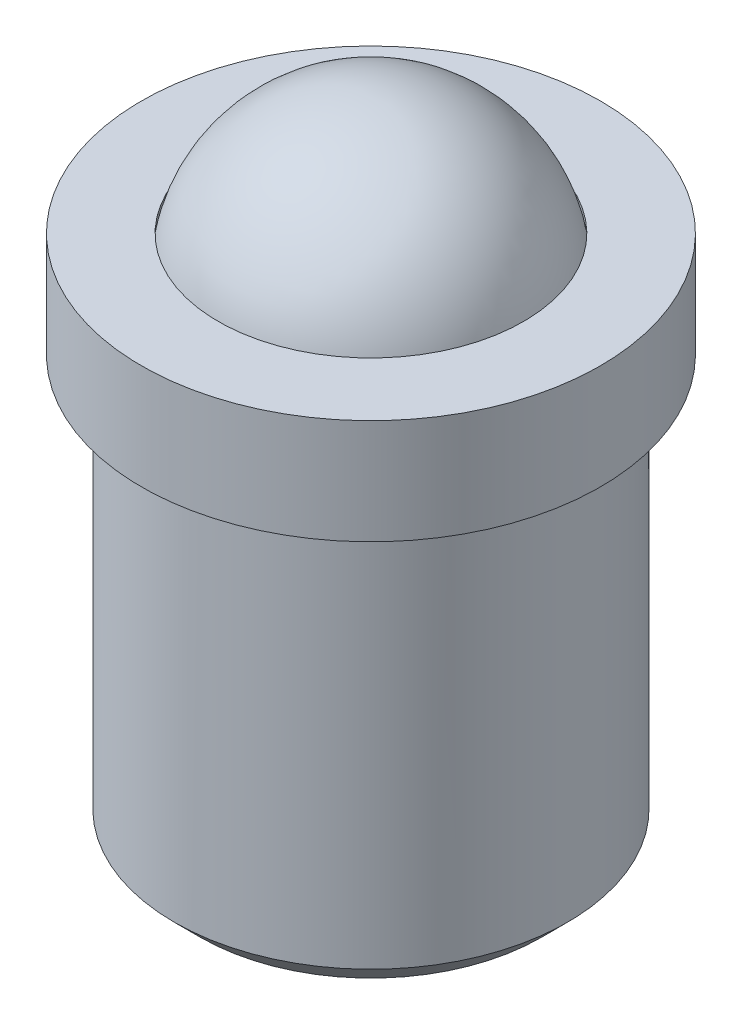
ISO-10303-21;
HEADER;
FILE_DESCRIPTION(('STEP AP214'),'2;1');
FILE_NAME('part.step','',(''),(''),'','','');
FILE_SCHEMA(('AUTOMOTIVE_DESIGN { 1 0 10303 214 1 1 1 1 }'));
ENDSEC;
DATA;
#1=APPLICATION_CONTEXT('core data for automotive mechanical design processes');
#2=APPLICATION_PROTOCOL_DEFINITION('international standard','automotive_design',2000,#1);
#3=PRODUCT_CONTEXT('',#1,'mechanical');
#4=PRODUCT('Part','Part','',(#3));
#5=PRODUCT_RELATED_PRODUCT_CATEGORY('part','',(#4));
#6=PRODUCT_DEFINITION_FORMATION('','',#4);
#7=PRODUCT_DEFINITION_CONTEXT('part definition',#1,'design');
#8=PRODUCT_DEFINITION('design','',#6,#7);
#9=PRODUCT_DEFINITION_SHAPE('','',#8);
#10=(LENGTH_UNIT() NAMED_UNIT(*) SI_UNIT(.MILLI.,.METRE.));
#11=(NAMED_UNIT(*) PLANE_ANGLE_UNIT() SI_UNIT($,.RADIAN.));
#12=(NAMED_UNIT(*) SI_UNIT($,.STERADIAN.) SOLID_ANGLE_UNIT());
#13=UNCERTAINTY_MEASURE_WITH_UNIT(LENGTH_MEASURE(1.E-05),#10,'distance_accuracy_value','');
#14=(GEOMETRIC_REPRESENTATION_CONTEXT(3) GLOBAL_UNCERTAINTY_ASSIGNED_CONTEXT((#13)) GLOBAL_UNIT_ASSIGNED_CONTEXT((#10,
#11,#12)) REPRESENTATION_CONTEXT('',''));
#15=CARTESIAN_POINT('',(0.,0.,0.));
#16=DIRECTION('',(0.,0.,1.));
#17=DIRECTION('',(1.,0.,0.));
#18=AXIS2_PLACEMENT_3D('',#15,#16,#17);
#19=CARTESIAN_POINT('',(0.,3.71,0.));
#20=DIRECTION('',(0.,1.,0.));
#21=DIRECTION('',(0.,0.,-1.));
#22=AXIS2_PLACEMENT_3D('',#19,#20,#21);
#23=SPHERICAL_SURFACE('',#22,1.19);
#24=CARTESIAN_POINT('',(0.,4.9,0.));
#25=VERTEX_POINT('',#24);
#26=VERTEX_LOOP('',#25);
#27=FACE_BOUND('',#26,.T.);
#28=ADVANCED_FACE('F37',(#27),#23,.T.);
#29=CLOSED_SHELL('',(#28));
#30=MANIFOLD_SOLID_BREP('B2',#29);
#31=CARTESIAN_POINT('',(0.,0.,0.));
#32=DIRECTION('',(0.,-1.,0.));
#33=DIRECTION('',(0.,0.,-1.));
#34=AXIS2_PLACEMENT_3D('',#31,#32,#33);
#35=CYLINDRICAL_SURFACE('',#34,1.5);
#36=CARTESIAN_POINT('',(0.,0.2,0.));
#37=DIRECTION('',(0.,-1.,0.));
#38=DIRECTION('',(0.,0.,-1.));
#39=AXIS2_PLACEMENT_3D('',#36,#37,#38);
#40=CIRCLE('',#39,1.5);
#41=CARTESIAN_POINT('',(0.,0.2,1.5));
#42=VERTEX_POINT('',#41);
#43=EDGE_CURVE('E36',#42,#42,#40,.F.);
#44=ORIENTED_EDGE('',*,*,#43,.T.);
#45=EDGE_LOOP('',(#44));
#46=FACE_BOUND('',#45,.T.);
#47=CARTESIAN_POINT('',(0.,3.2,0.));
#48=DIRECTION('',(0.,-1.,0.));
#49=DIRECTION('',(0.,0.,-1.));
#50=AXIS2_PLACEMENT_3D('',#47,#48,#49);
#51=CIRCLE('',#50,1.5);
#52=CARTESIAN_POINT('',(0.,3.2,-1.5));
#53=VERTEX_POINT('',#52);
#54=EDGE_CURVE('E60',#53,#53,#51,.T.);
#55=ORIENTED_EDGE('',*,*,#54,.T.);
#56=EDGE_LOOP('',(#55));
#57=FACE_BOUND('',#56,.T.);
#58=ADVANCED_FACE('F49',(#46,#57),#35,.T.);
#59=CARTESIAN_POINT('',(0.,3.2,-1.5));
#60=DIRECTION('',(0.,-1.,0.));
#61=DIRECTION('',(0.,0.,-1.));
#62=AXIS2_PLACEMENT_3D('',#59,#60,#61);
#63=PLANE('',#62);
#64=CARTESIAN_POINT('',(0.,3.2,0.));
#65=DIRECTION('',(0.,-1.,0.));
#66=DIRECTION('',(0.,0.,-1.));
#67=AXIS2_PLACEMENT_3D('',#64,#65,#66);
#68=CIRCLE('',#67,1.75);
#69=CARTESIAN_POINT('',(0.,3.2,-1.75));
#70=VERTEX_POINT('',#69);
#71=EDGE_CURVE('E64',#70,#70,#68,.T.);
#72=ORIENTED_EDGE('',*,*,#71,.T.);
#73=EDGE_LOOP('',(#72));
#74=FACE_BOUND('',#73,.T.);
#75=ORIENTED_EDGE('',*,*,#54,.F.);
#76=EDGE_LOOP('',(#75));
#77=FACE_BOUND('',#76,.T.);
#78=ADVANCED_FACE('F102',(#74,#77),#63,.T.);
#79=CARTESIAN_POINT('',(0.,0.,0.));
#80=DIRECTION('',(0.,-1.,0.));
#81=DIRECTION('',(0.,0.,-1.));
#82=AXIS2_PLACEMENT_3D('',#79,#80,#81);
#83=CYLINDRICAL_SURFACE('',#82,1.75);
#84=CARTESIAN_POINT('',(0.,4.,0.));
#85=DIRECTION('',(0.,-1.,0.));
#86=DIRECTION('',(0.,0.,-1.));
#87=AXIS2_PLACEMENT_3D('',#84,#85,#86);
#88=CIRCLE('',#87,1.75);
#89=CARTESIAN_POINT('',(0.,4.,-1.75));
#90=VERTEX_POINT('',#89);
#91=EDGE_CURVE('E69',#90,#90,#88,.T.);
#92=ORIENTED_EDGE('',*,*,#91,.T.);
#93=EDGE_LOOP('',(#92));
#94=FACE_BOUND('',#93,.T.);
#95=ORIENTED_EDGE('',*,*,#71,.F.);
#96=EDGE_LOOP('',(#95));
#97=FACE_BOUND('',#96,.T.);
#98=ADVANCED_FACE('F106',(#94,#97),#83,.T.);
#99=CARTESIAN_POINT('',(0.,4.,-1.75));
#100=DIRECTION('',(0.,1.,0.));
#101=DIRECTION('',(0.,0.,1.));
#102=AXIS2_PLACEMENT_3D('',#99,#100,#101);
#103=PLANE('',#102);
#104=CARTESIAN_POINT('',(0.,4.,0.));
#105=DIRECTION('',(0.,-1.,0.));
#106=DIRECTION('',(0.,0.,-1.));
#107=AXIS2_PLACEMENT_3D('',#104,#105,#106);
#108=CIRCLE('',#107,1.16443119161245);
#109=CARTESIAN_POINT('',(0.,4.,-1.16443119161245));
#110=VERTEX_POINT('',#109);
#111=EDGE_CURVE('E72',#110,#110,#108,.T.);
#112=ORIENTED_EDGE('',*,*,#111,.T.);
#113=EDGE_LOOP('',(#112));
#114=FACE_BOUND('',#113,.T.);
#115=ORIENTED_EDGE('',*,*,#91,.F.);
#116=EDGE_LOOP('',(#115));
#117=FACE_BOUND('',#116,.T.);
#118=ADVANCED_FACE('F113',(#114,#117),#103,.T.);
#119=CARTESIAN_POINT('',(0.,3.71,0.));
#120=DIRECTION('',(0.,-1.,0.));
#121=DIRECTION('',(0.,0.,-1.));
#122=AXIS2_PLACEMENT_3D('',#119,#120,#121);
#123=SPHERICAL_SURFACE('',#122,1.2);
#124=CARTESIAN_POINT('',(0.,3.71,0.));
#125=DIRECTION('',(0.,-1.,0.));
#126=DIRECTION('',(0.,0.,-1.));
#127=AXIS2_PLACEMENT_3D('',#124,#125,#126);
#128=CIRCLE('',#127,1.2);
#129=CARTESIAN_POINT('',(0.,3.71,-1.2));
#130=VERTEX_POINT('',#129);
#131=EDGE_CURVE('E75',#130,#130,#128,.T.);
#132=ORIENTED_EDGE('',*,*,#131,.T.);
#133=EDGE_LOOP('',(#132));
#134=FACE_BOUND('',#133,.T.);
#135=ORIENTED_EDGE('',*,*,#111,.F.);
#136=EDGE_LOOP('',(#135));
#137=FACE_BOUND('',#136,.T.);
#138=ADVANCED_FACE('F117',(#134,#137),#123,.F.);
#139=CARTESIAN_POINT('',(0.,0.,0.));
#140=DIRECTION('',(0.,-1.,0.));
#141=DIRECTION('',(0.,0.,-1.));
#142=AXIS2_PLACEMENT_3D('',#139,#140,#141);
#143=CYLINDRICAL_SURFACE('',#142,1.2);
#144=CARTESIAN_POINT('',(0.,0.3,0.));
#145=DIRECTION('',(0.,-1.,0.));
#146=DIRECTION('',(0.,0.,-1.));
#147=AXIS2_PLACEMENT_3D('',#144,#145,#146);
#148=CIRCLE('',#147,1.2);
#149=CARTESIAN_POINT('',(0.,0.3,-1.2));
#150=VERTEX_POINT('',#149);
#151=EDGE_CURVE('E78',#150,#150,#148,.T.);
#152=ORIENTED_EDGE('',*,*,#151,.T.);
#153=EDGE_LOOP('',(#152));
#154=FACE_BOUND('',#153,.T.);
#155=ORIENTED_EDGE('',*,*,#131,.F.);
#156=EDGE_LOOP('',(#155));
#157=FACE_BOUND('',#156,.T.);
#158=ADVANCED_FACE('F121',(#154,#157),#143,.F.);
#159=CARTESIAN_POINT('',(0.,0.3,-1.2));
#160=DIRECTION('',(0.,1.,0.));
#161=DIRECTION('',(0.,0.,1.));
#162=AXIS2_PLACEMENT_3D('',#159,#160,#161);
#163=PLANE('',#162);
#164=CARTESIAN_POINT('',(0.,0.3,0.));
#165=DIRECTION('',(0.,-1.,0.));
#166=DIRECTION('',(0.,0.,-1.));
#167=AXIS2_PLACEMENT_3D('',#164,#165,#166);
#168=CIRCLE('',#167,0.3);
#169=CARTESIAN_POINT('',(0.,0.3,-0.3));
#170=VERTEX_POINT('',#169);
#171=EDGE_CURVE('E81',#170,#170,#168,.T.);
#172=ORIENTED_EDGE('',*,*,#171,.T.);
#173=EDGE_LOOP('',(#172));
#174=FACE_BOUND('',#173,.T.);
#175=ORIENTED_EDGE('',*,*,#151,.F.);
#176=EDGE_LOOP('',(#175));
#177=FACE_BOUND('',#176,.T.);
#178=ADVANCED_FACE('F99',(#174,#177),#163,.T.);
#179=CARTESIAN_POINT('',(0.,0.,0.));
#180=DIRECTION('',(0.,-1.,0.));
#181=DIRECTION('',(0.,0.,-1.));
#182=AXIS2_PLACEMENT_3D('',#179,#180,#181);
#183=CYLINDRICAL_SURFACE('',#182,0.3);
#184=CARTESIAN_POINT('',(0.,0.,0.));
#185=DIRECTION('',(0.,-1.,0.));
#186=DIRECTION('',(0.,0.,-1.));
#187=AXIS2_PLACEMENT_3D('',#184,#185,#186);
#188=CIRCLE('',#187,0.3);
#189=CARTESIAN_POINT('',(0.,0.,-0.3));
#190=VERTEX_POINT('',#189);
#191=EDGE_CURVE('E84',#190,#190,#188,.T.);
#192=ORIENTED_EDGE('',*,*,#191,.T.);
#193=EDGE_LOOP('',(#192));
#194=FACE_BOUND('',#193,.T.);
#195=ORIENTED_EDGE('',*,*,#171,.F.);
#196=EDGE_LOOP('',(#195));
#197=FACE_BOUND('',#196,.T.);
#198=ADVANCED_FACE('F88',(#194,#197),#183,.F.);
#199=CARTESIAN_POINT('',(0.,0.,-0.3));
#200=DIRECTION('',(0.,-1.,0.));
#201=DIRECTION('',(0.,0.,-1.));
#202=AXIS2_PLACEMENT_3D('',#199,#200,#201);
#203=PLANE('',#202);
#204=CARTESIAN_POINT('',(0.,0.,0.));
#205=DIRECTION('',(0.,-1.,0.));
#206=DIRECTION('',(0.,0.,-1.));
#207=AXIS2_PLACEMENT_3D('',#204,#205,#206);
#208=CIRCLE('',#207,1.3);
#209=CARTESIAN_POINT('',(0.,0.,1.3));
#210=VERTEX_POINT('',#209);
#211=EDGE_CURVE('E56',#210,#210,#208,.T.);
#212=ORIENTED_EDGE('',*,*,#211,.T.);
#213=EDGE_LOOP('',(#212));
#214=FACE_BOUND('',#213,.T.);
#215=ORIENTED_EDGE('',*,*,#191,.F.);
#216=EDGE_LOOP('',(#215));
#217=FACE_BOUND('',#216,.T.);
#218=ADVANCED_FACE('F91',(#214,#217),#203,.T.);
#219=CARTESIAN_POINT('',(0.,0.,0.));
#220=DIRECTION('',(0.,1.,0.));
#221=DIRECTION('',(0.,0.,1.));
#222=AXIS2_PLACEMENT_3D('',#219,#220,#221);
#223=CONICAL_SURFACE('',#222,1.3,0.785398163397447);
#224=CARTESIAN_POINT('',(0.,0.2,1.5));
#225=CARTESIAN_POINT('',(0.,0.197916666666666,1.49791666666667));
#226=CARTESIAN_POINT('',(0.,0.195833333333333,1.49583333333333));
#227=CARTESIAN_POINT('',(0.,0.191666666666666,1.49166666666667));
#228=CARTESIAN_POINT('',(0.,0.189583333333333,1.48958333333333));
#229=CARTESIAN_POINT('',(0.,0.185416666666666,1.48541666666667));
#230=CARTESIAN_POINT('',(0.,0.183333333333333,1.48333333333333));
#231=CARTESIAN_POINT('',(0.,0.179166666666666,1.47916666666667));
#232=CARTESIAN_POINT('',(0.,0.177083333333333,1.47708333333333));
#233=CARTESIAN_POINT('',(0.,0.172916666666666,1.47291666666667));
#234=CARTESIAN_POINT('',(0.,0.170833333333333,1.47083333333333));
#235=CARTESIAN_POINT('',(0.,0.166666666666666,1.46666666666667));
#236=CARTESIAN_POINT('',(0.,0.164583333333333,1.46458333333333));
#237=CARTESIAN_POINT('',(0.,0.160416666666666,1.46041666666667));
#238=CARTESIAN_POINT('',(0.,0.158333333333333,1.45833333333333));
#239=CARTESIAN_POINT('',(0.,0.154166666666666,1.45416666666667));
#240=CARTESIAN_POINT('',(0.,0.152083333333333,1.45208333333333));
#241=CARTESIAN_POINT('',(0.,0.147916666666666,1.44791666666667));
#242=CARTESIAN_POINT('',(0.,0.145833333333333,1.44583333333333));
#243=CARTESIAN_POINT('',(0.,0.141666666666666,1.44166666666667));
#244=CARTESIAN_POINT('',(0.,0.139583333333333,1.43958333333333));
#245=CARTESIAN_POINT('',(0.,0.135416666666666,1.43541666666667));
#246=CARTESIAN_POINT('',(0.,0.133333333333333,1.43333333333333));
#247=CARTESIAN_POINT('',(0.,0.129166666666666,1.42916666666667));
#248=CARTESIAN_POINT('',(0.,0.127083333333333,1.42708333333333));
#249=CARTESIAN_POINT('',(0.,0.122916666666666,1.42291666666667));
#250=CARTESIAN_POINT('',(0.,0.120833333333333,1.42083333333333));
#251=CARTESIAN_POINT('',(0.,0.116666666666666,1.41666666666667));
#252=CARTESIAN_POINT('',(0.,0.114583333333333,1.41458333333333));
#253=CARTESIAN_POINT('',(0.,0.110416666666666,1.41041666666667));
#254=CARTESIAN_POINT('',(0.,0.108333333333333,1.40833333333333));
#255=CARTESIAN_POINT('',(0.,0.104166666666666,1.40416666666667));
#256=CARTESIAN_POINT('',(0.,0.102083333333333,1.40208333333333));
#257=CARTESIAN_POINT('',(0.,0.0979166666666665,1.39791666666667));
#258=CARTESIAN_POINT('',(0.,0.0958333333333332,1.39583333333333));
#259=CARTESIAN_POINT('',(0.,0.0916666666666665,1.39166666666667));
#260=CARTESIAN_POINT('',(0.,0.0895833333333332,1.38958333333333));
#261=CARTESIAN_POINT('',(0.,0.0854166666666665,1.38541666666667));
#262=CARTESIAN_POINT('',(0.,0.0833333333333332,1.38333333333333));
#263=CARTESIAN_POINT('',(0.,0.0791666666666665,1.37916666666667));
#264=CARTESIAN_POINT('',(0.,0.0770833333333332,1.37708333333333));
#265=CARTESIAN_POINT('',(0.,0.0729166666666665,1.37291666666667));
#266=CARTESIAN_POINT('',(0.,0.0708333333333332,1.37083333333333));
#267=CARTESIAN_POINT('',(0.,0.0666666666666666,1.36666666666667));
#268=CARTESIAN_POINT('',(0.,0.0645833333333332,1.36458333333333));
#269=CARTESIAN_POINT('',(0.,0.0604166666666666,1.36041666666667));
#270=CARTESIAN_POINT('',(0.,0.0583333333333332,1.35833333333333));
#271=CARTESIAN_POINT('',(0.,0.0541666666666666,1.35416666666667));
#272=CARTESIAN_POINT('',(0.,0.0520833333333333,1.35208333333333));
#273=CARTESIAN_POINT('',(0.,0.0479166666666666,1.34791666666667));
#274=CARTESIAN_POINT('',(0.,0.0458333333333333,1.34583333333333));
#275=CARTESIAN_POINT('',(0.,0.0416666666666666,1.34166666666667));
#276=CARTESIAN_POINT('',(0.,0.0395833333333333,1.33958333333333));
#277=CARTESIAN_POINT('',(0.,0.0354166666666666,1.33541666666667));
#278=CARTESIAN_POINT('',(0.,0.0333333333333333,1.33333333333333));
#279=CARTESIAN_POINT('',(0.,0.0291666666666666,1.32916666666667));
#280=CARTESIAN_POINT('',(0.,0.0270833333333333,1.32708333333333));
#281=CARTESIAN_POINT('',(0.,0.0229166666666666,1.32291666666667));
#282=CARTESIAN_POINT('',(0.,0.0208333333333333,1.32083333333333));
#283=CARTESIAN_POINT('',(0.,0.0166666666666666,1.31666666666667));
#284=CARTESIAN_POINT('',(0.,0.0145833333333333,1.31458333333333));
#285=CARTESIAN_POINT('',(0.,0.0104166666666666,1.31041666666667));
#286=CARTESIAN_POINT('',(0.,0.00833333333333332,1.30833333333333));
#287=CARTESIAN_POINT('',(0.,0.00416666666666666,1.30416666666667));
#288=CARTESIAN_POINT('',(0.,0.00208333333333333,1.30208333333333));
#289=CARTESIAN_POINT('',(0.,0.,1.3));
#290=B_SPLINE_CURVE_WITH_KNOTS('',3,(#224,#225,#226,#227,#228,#229,#230,#231,#232,#233,#234,
#235,#236,#237,#238,#239,#240,#241,#242,#243,#244,#245,#246,#247,#248,#249,#250,#251,#252,#253,
#254,#255,#256,#257,#258,#259,#260,#261,#262,#263,#264,#265,#266,#267,#268,#269,#270,#271,#272,
#273,#274,#275,#276,#277,#278,#279,#280,#281,#282,#283,#284,#285,#286,#287,#288,#289),
.UNSPECIFIED.,.F.,.F.,(4,2,2,2,2,2,2,2,2,2,2,2,2,2,2,2,2,2,2,2,2,2,2,2,2,2,2,2,2,2,2,2,4),(0.,
0.00883883476483181,0.0176776695296636,0.0265165042944954,0.0353553390593272,0.044194173824159,
0.0530330085889909,0.0618718433538227,0.0707106781186545,0.0795495128834865,0.0883883476483181,
0.0972271824131501,0.106066017177982,0.114904851942814,0.123743686707646,0.132582521472477,
0.141421356237309,0.150260191002141,0.159099025766973,0.167937860531805,0.176776695296636,
0.185615530061468,0.1944543648263,0.203293199591132,0.212132034355964,0.220970869120795,
0.229809703885627,0.238648538650459,0.247487373415291,0.256326208180123,0.265165042944955,
0.274003877709786,0.282842712474618),.UNSPECIFIED.);
#291=EDGE_CURVE('BSEAM51',#42,#210,#290,.T.);
#292=ORIENTED_EDGE('',*,*,#43,.F.);
#293=ORIENTED_EDGE('',*,*,#211,.F.);
#294=ORIENTED_EDGE('',*,*,#291,.T.);
#295=ORIENTED_EDGE('',*,*,#291,.F.);
#296=EDGE_LOOP('',(#292,#294,#293,#295));
#297=FACE_BOUND('',#296,.T.);
#298=ADVANCED_FACE('F51',(#297),#223,.T.);
#299=CLOSED_SHELL('',(#58,#78,#98,#118,#138,#158,#178,#198,#218,#298));
#300=MANIFOLD_SOLID_BREP('B6',#299);
#301=ADVANCED_BREP_SHAPE_REPRESENTATION('',(#18,#30,#300),#14);
#302=SHAPE_DEFINITION_REPRESENTATION(#9,#301);
ENDSEC;
END-ISO-10303-21;
